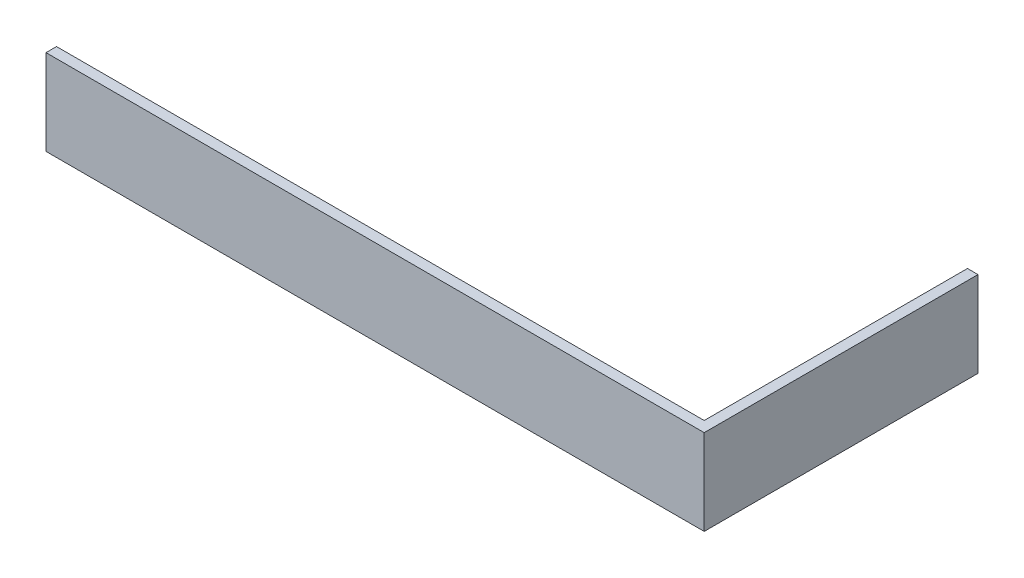
ISO-10303-21;
HEADER;
FILE_DESCRIPTION(('STEP AP214'),'2;1');
FILE_NAME('part.step','',(''),(''),'','','');
FILE_SCHEMA(('AUTOMOTIVE_DESIGN { 1 0 10303 214 1 1 1 1 }'));
ENDSEC;
DATA;
#1=APPLICATION_CONTEXT('core data for automotive mechanical design processes');
#2=APPLICATION_PROTOCOL_DEFINITION('international standard','automotive_design',2000,#1);
#3=PRODUCT_CONTEXT('',#1,'mechanical');
#4=PRODUCT('Part','Part','',(#3));
#5=PRODUCT_RELATED_PRODUCT_CATEGORY('part','',(#4));
#6=PRODUCT_DEFINITION_FORMATION('','',#4);
#7=PRODUCT_DEFINITION_CONTEXT('part definition',#1,'design');
#8=PRODUCT_DEFINITION('design','',#6,#7);
#9=PRODUCT_DEFINITION_SHAPE('','',#8);
#10=(LENGTH_UNIT() NAMED_UNIT(*) SI_UNIT(.MILLI.,.METRE.));
#11=(NAMED_UNIT(*) PLANE_ANGLE_UNIT() SI_UNIT($,.RADIAN.));
#12=(NAMED_UNIT(*) SI_UNIT($,.STERADIAN.) SOLID_ANGLE_UNIT());
#13=UNCERTAINTY_MEASURE_WITH_UNIT(LENGTH_MEASURE(1.E-05),#10,'distance_accuracy_value','');
#14=(GEOMETRIC_REPRESENTATION_CONTEXT(3) GLOBAL_UNCERTAINTY_ASSIGNED_CONTEXT((#13)) GLOBAL_UNIT_ASSIGNED_CONTEXT((#10,
#11,#12)) REPRESENTATION_CONTEXT('',''));
#15=CARTESIAN_POINT('',(0.,0.,0.));
#16=DIRECTION('',(0.,0.,1.));
#17=DIRECTION('',(1.,0.,0.));
#18=AXIS2_PLACEMENT_3D('',#15,#16,#17);
#19=CARTESIAN_POINT('',(50.,-6.5,1.6));
#20=DIRECTION('',(-1.,0.,0.));
#21=DIRECTION('',(0.,0.,1.));
#22=AXIS2_PLACEMENT_3D('',#19,#20,#21);
#23=PLANE('',#22);
#24=DIRECTION('',(0.,0.,-1.));
#25=VECTOR('',#24,1.);
#26=CARTESIAN_POINT('',(50.,-6.5,1.6));
#27=LINE('',#26,#25);
#28=CARTESIAN_POINT('',(50.,-6.5,1.6));
#29=VERTEX_POINT('',#28);
#30=CARTESIAN_POINT('',(50.,-6.5,-40.));
#31=VERTEX_POINT('',#30);
#32=EDGE_CURVE('E99',#29,#31,#27,.T.);
#33=ORIENTED_EDGE('',*,*,#32,.T.);
#34=DIRECTION('',(0.,-1.,0.));
#35=VECTOR('',#34,1.);
#36=CARTESIAN_POINT('',(50.,-6.5,-40.));
#37=LINE('',#36,#35);
#38=CARTESIAN_POINT('',(50.,6.5,-40.));
#39=VERTEX_POINT('',#38);
#40=EDGE_CURVE('E103',#39,#31,#37,.T.);
#41=ORIENTED_EDGE('',*,*,#40,.F.);
#42=DIRECTION('',(0.,0.,-1.));
#43=VECTOR('',#42,1.);
#44=CARTESIAN_POINT('',(50.,6.5,1.6));
#45=LINE('',#44,#43);
#46=CARTESIAN_POINT('',(50.,6.5,1.6));
#47=VERTEX_POINT('',#46);
#48=EDGE_CURVE('E11',#47,#39,#45,.T.);
#49=ORIENTED_EDGE('',*,*,#48,.F.);
#50=DIRECTION('',(0.,1.,0.));
#51=VECTOR('',#50,1.);
#52=CARTESIAN_POINT('',(50.,-6.5,1.6));
#53=LINE('',#52,#51);
#54=EDGE_CURVE('E104',#29,#47,#53,.T.);
#55=ORIENTED_EDGE('',*,*,#54,.F.);
#56=EDGE_LOOP('',(#33,#41,#49,#55));
#57=FACE_BOUND('',#56,.T.);
#58=ADVANCED_FACE('F37',(#57),#23,.F.);
#59=CARTESIAN_POINT('',(-50.,6.5,1.6));
#60=DIRECTION('',(0.,-1.,0.));
#61=DIRECTION('',(0.,0.,-1.));
#62=AXIS2_PLACEMENT_3D('',#59,#60,#61);
#63=PLANE('',#62);
#64=ORIENTED_EDGE('',*,*,#48,.T.);
#65=DIRECTION('',(1.,0.,0.));
#66=VECTOR('',#65,1.);
#67=CARTESIAN_POINT('',(50.,6.5,-40.));
#68=LINE('',#67,#66);
#69=CARTESIAN_POINT('',(48.4,6.5,-40.));
#70=VERTEX_POINT('',#69);
#71=EDGE_CURVE('E120',#70,#39,#68,.T.);
#72=ORIENTED_EDGE('',*,*,#71,.F.);
#73=DIRECTION('',(0.,0.,1.));
#74=VECTOR('',#73,1.);
#75=CARTESIAN_POINT('',(48.4,6.5,-40.));
#76=LINE('',#75,#74);
#77=CARTESIAN_POINT('',(48.4,6.5,0.));
#78=VERTEX_POINT('',#77);
#79=EDGE_CURVE('E125',#70,#78,#76,.T.);
#80=ORIENTED_EDGE('',*,*,#79,.T.);
#81=DIRECTION('',(-1.,0.,0.));
#82=VECTOR('',#81,1.);
#83=CARTESIAN_POINT('',(-50.,6.5,0.));
#84=LINE('',#83,#82);
#85=CARTESIAN_POINT('',(-50.,6.5,0.));
#86=VERTEX_POINT('',#85);
#87=EDGE_CURVE('E130',#78,#86,#84,.T.);
#88=ORIENTED_EDGE('',*,*,#87,.T.);
#89=DIRECTION('',(0.,0.,-1.));
#90=VECTOR('',#89,1.);
#91=CARTESIAN_POINT('',(-50.,6.5,1.6));
#92=LINE('',#91,#90);
#93=CARTESIAN_POINT('',(-50.,6.5,1.6));
#94=VERTEX_POINT('',#93);
#95=EDGE_CURVE('E44',#94,#86,#92,.T.);
#96=ORIENTED_EDGE('',*,*,#95,.F.);
#97=DIRECTION('',(-1.,0.,0.));
#98=VECTOR('',#97,1.);
#99=CARTESIAN_POINT('',(-50.,6.5,1.6));
#100=LINE('',#99,#98);
#101=EDGE_CURVE('E83',#47,#94,#100,.T.);
#102=ORIENTED_EDGE('',*,*,#101,.F.);
#103=EDGE_LOOP('',(#64,#72,#80,#88,#96,#102));
#104=FACE_BOUND('',#103,.T.);
#105=ADVANCED_FACE('F146',(#104),#63,.F.);
#106=CARTESIAN_POINT('',(-50.,-6.5,1.6));
#107=DIRECTION('',(1.,0.,0.));
#108=DIRECTION('',(0.,0.,-1.));
#109=AXIS2_PLACEMENT_3D('',#106,#107,#108);
#110=PLANE('',#109);
#111=DIRECTION('',(0.,-1.,0.));
#112=VECTOR('',#111,1.);
#113=CARTESIAN_POINT('',(-50.,-6.5,0.));
#114=LINE('',#113,#112);
#115=CARTESIAN_POINT('',(-50.,-6.5,0.));
#116=VERTEX_POINT('',#115);
#117=EDGE_CURVE('E76',#86,#116,#114,.T.);
#118=ORIENTED_EDGE('',*,*,#117,.T.);
#119=DIRECTION('',(0.,0.,-1.));
#120=VECTOR('',#119,1.);
#121=CARTESIAN_POINT('',(-50.,-6.5,1.6));
#122=LINE('',#121,#120);
#123=CARTESIAN_POINT('',(-50.,-6.5,1.6));
#124=VERTEX_POINT('',#123);
#125=EDGE_CURVE('E106',#124,#116,#122,.T.);
#126=ORIENTED_EDGE('',*,*,#125,.F.);
#127=DIRECTION('',(0.,-1.,0.));
#128=VECTOR('',#127,1.);
#129=CARTESIAN_POINT('',(-50.,-6.5,1.6));
#130=LINE('',#129,#128);
#131=EDGE_CURVE('E134',#94,#124,#130,.T.);
#132=ORIENTED_EDGE('',*,*,#131,.F.);
#133=ORIENTED_EDGE('',*,*,#95,.T.);
#134=EDGE_LOOP('',(#118,#126,#132,#133));
#135=FACE_BOUND('',#134,.T.);
#136=ADVANCED_FACE('F141',(#135),#110,.F.);
#137=CARTESIAN_POINT('',(-50.,-6.5,1.6));
#138=DIRECTION('',(0.,1.,0.));
#139=DIRECTION('',(0.,0.,1.));
#140=AXIS2_PLACEMENT_3D('',#137,#138,#139);
#141=PLANE('',#140);
#142=DIRECTION('',(1.,0.,0.));
#143=VECTOR('',#142,1.);
#144=CARTESIAN_POINT('',(-50.,-6.5,0.));
#145=LINE('',#144,#143);
#146=CARTESIAN_POINT('',(48.4,-6.5,0.));
#147=VERTEX_POINT('',#146);
#148=EDGE_CURVE('E132',#116,#147,#145,.T.);
#149=ORIENTED_EDGE('',*,*,#148,.T.);
#150=DIRECTION('',(0.,0.,1.));
#151=VECTOR('',#150,1.);
#152=CARTESIAN_POINT('',(48.4,-6.5,-40.));
#153=LINE('',#152,#151);
#154=CARTESIAN_POINT('',(48.4,-6.5,-40.));
#155=VERTEX_POINT('',#154);
#156=EDGE_CURVE('E112',#155,#147,#153,.T.);
#157=ORIENTED_EDGE('',*,*,#156,.F.);
#158=DIRECTION('',(-1.,0.,0.));
#159=VECTOR('',#158,1.);
#160=CARTESIAN_POINT('',(50.,-6.5,-40.));
#161=LINE('',#160,#159);
#162=EDGE_CURVE('E109',#31,#155,#161,.T.);
#163=ORIENTED_EDGE('',*,*,#162,.F.);
#164=ORIENTED_EDGE('',*,*,#32,.F.);
#165=DIRECTION('',(1.,0.,0.));
#166=VECTOR('',#165,1.);
#167=CARTESIAN_POINT('',(-50.,-6.5,1.6));
#168=LINE('',#167,#166);
#169=EDGE_CURVE('E60',#124,#29,#168,.T.);
#170=ORIENTED_EDGE('',*,*,#169,.F.);
#171=ORIENTED_EDGE('',*,*,#125,.T.);
#172=EDGE_LOOP('',(#149,#157,#163,#164,#170,#171));
#173=FACE_BOUND('',#172,.T.);
#174=ADVANCED_FACE('F110',(#173),#141,.F.);
#175=CARTESIAN_POINT('',(0.,0.,1.6));
#176=DIRECTION('',(0.,0.,-1.));
#177=DIRECTION('',(-1.,0.,0.));
#178=AXIS2_PLACEMENT_3D('',#175,#176,#177);
#179=PLANE('',#178);
#180=ORIENTED_EDGE('',*,*,#54,.T.);
#181=ORIENTED_EDGE('',*,*,#101,.T.);
#182=ORIENTED_EDGE('',*,*,#131,.T.);
#183=ORIENTED_EDGE('',*,*,#169,.T.);
#184=EDGE_LOOP('',(#180,#181,#182,#183));
#185=FACE_BOUND('',#184,.T.);
#186=ADVANCED_FACE('F156',(#185),#179,.F.);
#187=CARTESIAN_POINT('',(0.,0.,0.));
#188=DIRECTION('',(0.,0.,-1.));
#189=DIRECTION('',(-1.,0.,0.));
#190=AXIS2_PLACEMENT_3D('',#187,#188,#189);
#191=PLANE('',#190);
#192=DIRECTION('',(0.,1.,0.));
#193=VECTOR('',#192,1.);
#194=CARTESIAN_POINT('',(48.4,-6.5,0.));
#195=LINE('',#194,#193);
#196=EDGE_CURVE('E51',#147,#78,#195,.T.);
#197=ORIENTED_EDGE('',*,*,#196,.F.);
#198=ORIENTED_EDGE('',*,*,#148,.F.);
#199=ORIENTED_EDGE('',*,*,#117,.F.);
#200=ORIENTED_EDGE('',*,*,#87,.F.);
#201=EDGE_LOOP('',(#197,#198,#199,#200));
#202=FACE_BOUND('',#201,.T.);
#203=ADVANCED_FACE('F142',(#202),#191,.T.);
#204=CARTESIAN_POINT('',(48.4,-6.5,-40.));
#205=DIRECTION('',(1.,0.,0.));
#206=DIRECTION('',(0.,0.,-1.));
#207=AXIS2_PLACEMENT_3D('',#204,#205,#206);
#208=PLANE('',#207);
#209=ORIENTED_EDGE('',*,*,#196,.T.);
#210=ORIENTED_EDGE('',*,*,#79,.F.);
#211=DIRECTION('',(0.,1.,0.));
#212=VECTOR('',#211,1.);
#213=CARTESIAN_POINT('',(48.4,-6.5,-40.));
#214=LINE('',#213,#212);
#215=EDGE_CURVE('E115',#155,#70,#214,.T.);
#216=ORIENTED_EDGE('',*,*,#215,.F.);
#217=ORIENTED_EDGE('',*,*,#156,.T.);
#218=EDGE_LOOP('',(#209,#210,#216,#217));
#219=FACE_BOUND('',#218,.T.);
#220=ADVANCED_FACE('F144',(#219),#208,.F.);
#221=CARTESIAN_POINT('',(0.,0.,-40.));
#222=DIRECTION('',(0.,0.,1.));
#223=DIRECTION('',(1.,0.,0.));
#224=AXIS2_PLACEMENT_3D('',#221,#222,#223);
#225=PLANE('',#224);
#226=ORIENTED_EDGE('',*,*,#40,.T.);
#227=ORIENTED_EDGE('',*,*,#162,.T.);
#228=ORIENTED_EDGE('',*,*,#215,.T.);
#229=ORIENTED_EDGE('',*,*,#71,.T.);
#230=EDGE_LOOP('',(#226,#227,#228,#229));
#231=FACE_BOUND('',#230,.T.);
#232=ADVANCED_FACE('F118',(#231),#225,.F.);
#233=CLOSED_SHELL('',(#58,#105,#136,#174,#186,#203,#220,#232));
#234=MANIFOLD_SOLID_BREP('B2',#233);
#235=ADVANCED_BREP_SHAPE_REPRESENTATION('',(#18,#234),#14);
#236=SHAPE_DEFINITION_REPRESENTATION(#9,#235);
ENDSEC;
END-ISO-10303-21;
